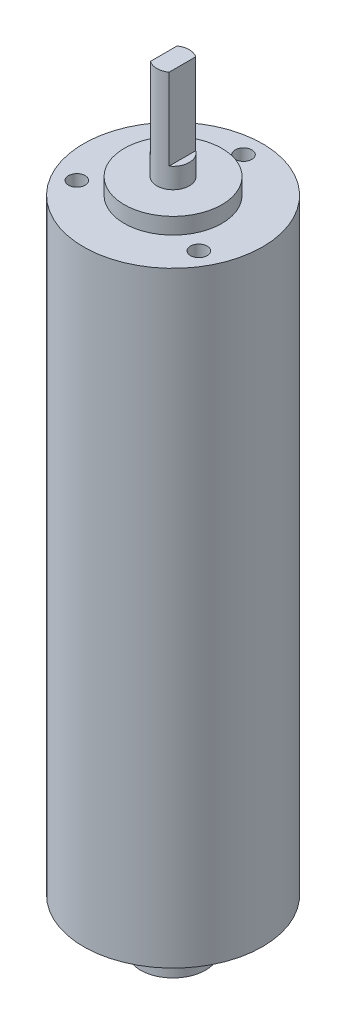
ISO-10303-21;
HEADER;
FILE_DESCRIPTION(('STEP AP214'),'2;1');
FILE_NAME('part.step','',(''),(''),'','','');
FILE_SCHEMA(('AUTOMOTIVE_DESIGN { 1 0 10303 214 1 1 1 1 }'));
ENDSEC;
DATA;
#1=APPLICATION_CONTEXT('core data for automotive mechanical design processes');
#2=APPLICATION_PROTOCOL_DEFINITION('international standard','automotive_design',2000,#1);
#3=PRODUCT_CONTEXT('',#1,'mechanical');
#4=PRODUCT('Part','Part','',(#3));
#5=PRODUCT_RELATED_PRODUCT_CATEGORY('part','',(#4));
#6=PRODUCT_DEFINITION_FORMATION('','',#4);
#7=PRODUCT_DEFINITION_CONTEXT('part definition',#1,'design');
#8=PRODUCT_DEFINITION('design','',#6,#7);
#9=PRODUCT_DEFINITION_SHAPE('','',#8);
#10=(LENGTH_UNIT() NAMED_UNIT(*) SI_UNIT(.MILLI.,.METRE.));
#11=(NAMED_UNIT(*) PLANE_ANGLE_UNIT() SI_UNIT($,.RADIAN.));
#12=(NAMED_UNIT(*) SI_UNIT($,.STERADIAN.) SOLID_ANGLE_UNIT());
#13=UNCERTAINTY_MEASURE_WITH_UNIT(LENGTH_MEASURE(1.E-05),#10,'distance_accuracy_value','');
#14=(GEOMETRIC_REPRESENTATION_CONTEXT(3) GLOBAL_UNCERTAINTY_ASSIGNED_CONTEXT((#13)) GLOBAL_UNIT_ASSIGNED_CONTEXT((#10,
#11,#12)) REPRESENTATION_CONTEXT('',''));
#15=CARTESIAN_POINT('',(0.,0.,0.));
#16=DIRECTION('',(0.,0.,1.));
#17=DIRECTION('',(1.,0.,0.));
#18=AXIS2_PLACEMENT_3D('',#15,#16,#17);
#19=CARTESIAN_POINT('',(0.,0.,0.));
#20=DIRECTION('',(0.,-1.,0.));
#21=DIRECTION('',(1.,0.,0.));
#22=AXIS2_PLACEMENT_3D('',#19,#20,#21);
#23=CYLINDRICAL_SURFACE('',#22,2.);
#24=CARTESIAN_POINT('',(0.,82.5,0.));
#25=DIRECTION('',(0.,-1.,0.));
#26=DIRECTION('',(1.,0.,0.));
#27=AXIS2_PLACEMENT_3D('',#24,#25,#26);
#28=CIRCLE('',#27,2.);
#29=CARTESIAN_POINT('',(2.,82.5,0.));
#30=VERTEX_POINT('',#29);
#31=EDGE_CURVE('E193',#30,#30,#28,.T.);
#32=ORIENTED_EDGE('',*,*,#31,.F.);
#33=EDGE_LOOP('',(#32));
#34=FACE_BOUND('',#33,.T.);
#35=CARTESIAN_POINT('',(0.,85.,0.));
#36=DIRECTION('',(0.,1.,0.));
#37=DIRECTION('',(0.,0.,1.));
#38=AXIS2_PLACEMENT_3D('',#35,#36,#37);
#39=CIRCLE('',#38,2.);
#40=CARTESIAN_POINT('',(-1.15,85.,-1.63630681719536));
#41=VERTEX_POINT('',#40);
#42=CARTESIAN_POINT('',(-1.15,85.,1.63630681719536));
#43=VERTEX_POINT('',#42);
#44=EDGE_CURVE('E161',#41,#43,#39,.T.);
#45=ORIENTED_EDGE('',*,*,#44,.F.);
#46=DIRECTION('',(0.,1.,0.));
#47=VECTOR('',#46,1.);
#48=CARTESIAN_POINT('',(-1.15,85.,-1.63630681719536));
#49=LINE('',#48,#47);
#50=CARTESIAN_POINT('',(-1.15,95.,-1.63630681719536));
#51=VERTEX_POINT('',#50);
#52=EDGE_CURVE('E166',#41,#51,#49,.T.);
#53=ORIENTED_EDGE('',*,*,#52,.T.);
#54=CARTESIAN_POINT('',(0.,95.,0.));
#55=DIRECTION('',(0.,-1.,0.));
#56=DIRECTION('',(1.,0.,0.));
#57=AXIS2_PLACEMENT_3D('',#54,#55,#56);
#58=CIRCLE('',#57,2.);
#59=CARTESIAN_POINT('',(1.15,95.,-1.63630681719536));
#60=VERTEX_POINT('',#59);
#61=EDGE_CURVE('E171',#51,#60,#58,.T.);
#62=ORIENTED_EDGE('',*,*,#61,.T.);
#63=DIRECTION('',(0.,1.,0.));
#64=VECTOR('',#63,1.);
#65=CARTESIAN_POINT('',(1.15,85.,-1.63630681719536));
#66=LINE('',#65,#64);
#67=CARTESIAN_POINT('',(1.15,85.,-1.63630681719536));
#68=VERTEX_POINT('',#67);
#69=EDGE_CURVE('E67',#68,#60,#66,.T.);
#70=ORIENTED_EDGE('',*,*,#69,.F.);
#71=CARTESIAN_POINT('',(0.,85.,0.));
#72=DIRECTION('',(0.,1.,0.));
#73=DIRECTION('',(0.,0.,1.));
#74=AXIS2_PLACEMENT_3D('',#71,#72,#73);
#75=CIRCLE('',#74,2.);
#76=CARTESIAN_POINT('',(1.15,85.,1.63630681719536));
#77=VERTEX_POINT('',#76);
#78=EDGE_CURVE('E175',#77,#68,#75,.T.);
#79=ORIENTED_EDGE('',*,*,#78,.F.);
#80=DIRECTION('',(0.,1.,0.));
#81=VECTOR('',#80,1.);
#82=CARTESIAN_POINT('',(1.15,85.,1.63630681719536));
#83=LINE('',#82,#81);
#84=CARTESIAN_POINT('',(1.15,95.,1.63630681719536));
#85=VERTEX_POINT('',#84);
#86=EDGE_CURVE('E168',#77,#85,#83,.T.);
#87=ORIENTED_EDGE('',*,*,#86,.T.);
#88=CARTESIAN_POINT('',(-1.15,95.,1.63630681719536));
#89=VERTEX_POINT('',#88);
#90=EDGE_CURVE('E189',#85,#89,#58,.T.);
#91=ORIENTED_EDGE('',*,*,#90,.T.);
#92=DIRECTION('',(0.,1.,0.));
#93=VECTOR('',#92,1.);
#94=CARTESIAN_POINT('',(-1.15,85.,1.63630681719536));
#95=LINE('',#94,#93);
#96=EDGE_CURVE('E75',#43,#89,#95,.T.);
#97=ORIENTED_EDGE('',*,*,#96,.F.);
#98=EDGE_LOOP('',(#45,#53,#62,#70,#79,#87,#91,#97));
#99=FACE_BOUND('',#98,.T.);
#100=ADVANCED_FACE('F51',(#34,#99),#23,.T.);
#101=CARTESIAN_POINT('',(2.,95.,0.));
#102=DIRECTION('',(0.,1.,0.));
#103=DIRECTION('',(-1.,0.,0.));
#104=AXIS2_PLACEMENT_3D('',#101,#102,#103);
#105=PLANE('',#104);
#106=ORIENTED_EDGE('',*,*,#61,.F.);
#107=DIRECTION('',(0.,0.,1.));
#108=VECTOR('',#107,1.);
#109=CARTESIAN_POINT('',(-1.15,95.,0.));
#110=LINE('',#109,#108);
#111=EDGE_CURVE('E162',#51,#89,#110,.T.);
#112=ORIENTED_EDGE('',*,*,#111,.T.);
#113=ORIENTED_EDGE('',*,*,#90,.F.);
#114=DIRECTION('',(0.,0.,1.));
#115=VECTOR('',#114,1.);
#116=CARTESIAN_POINT('',(1.15,95.,0.));
#117=LINE('',#116,#115);
#118=EDGE_CURVE('E157',#60,#85,#117,.T.);
#119=ORIENTED_EDGE('',*,*,#118,.F.);
#120=EDGE_LOOP('',(#106,#112,#113,#119));
#121=FACE_BOUND('',#120,.T.);
#122=ADVANCED_FACE('F240',(#121),#105,.T.);
#123=CARTESIAN_POINT('',(0.,0.,0.));
#124=DIRECTION('',(0.,-1.,0.));
#125=DIRECTION('',(1.,0.,0.));
#126=AXIS2_PLACEMENT_3D('',#123,#124,#125);
#127=PLANE('',#126);
#128=CARTESIAN_POINT('',(0.,0.,0.));
#129=DIRECTION('',(0.,-1.,0.));
#130=DIRECTION('',(1.,0.,0.));
#131=AXIS2_PLACEMENT_3D('',#128,#129,#130);
#132=CIRCLE('',#131,4.);
#133=CARTESIAN_POINT('',(4.,0.,0.));
#134=VERTEX_POINT('',#133);
#135=EDGE_CURVE('E11',#134,#134,#132,.T.);
#136=ORIENTED_EDGE('',*,*,#135,.T.);
#137=EDGE_LOOP('',(#136));
#138=FACE_BOUND('',#137,.T.);
#139=ADVANCED_FACE('F53',(#138),#127,.T.);
#140=CARTESIAN_POINT('',(0.,0.,0.));
#141=DIRECTION('',(0.,-1.,0.));
#142=DIRECTION('',(1.,0.,0.));
#143=AXIS2_PLACEMENT_3D('',#140,#141,#142);
#144=CYLINDRICAL_SURFACE('',#143,4.);
#145=CARTESIAN_POINT('',(0.,3.,0.));
#146=DIRECTION('',(0.,-1.,0.));
#147=DIRECTION('',(1.,0.,0.));
#148=AXIS2_PLACEMENT_3D('',#145,#146,#147);
#149=CIRCLE('',#148,4.);
#150=CARTESIAN_POINT('',(4.,3.,0.));
#151=VERTEX_POINT('',#150);
#152=EDGE_CURVE('E60',#151,#151,#149,.T.);
#153=ORIENTED_EDGE('',*,*,#152,.T.);
#154=EDGE_LOOP('',(#153));
#155=FACE_BOUND('',#154,.T.);
#156=ORIENTED_EDGE('',*,*,#135,.F.);
#157=EDGE_LOOP('',(#156));
#158=FACE_BOUND('',#157,.T.);
#159=ADVANCED_FACE('F224',(#155,#158),#144,.T.);
#160=CARTESIAN_POINT('',(4.,3.,0.));
#161=DIRECTION('',(0.,1.,0.));
#162=DIRECTION('',(-1.,0.,0.));
#163=AXIS2_PLACEMENT_3D('',#160,#161,#162);
#164=PLANE('',#163);
#165=CARTESIAN_POINT('',(0.,3.,0.));
#166=DIRECTION('',(0.,-1.,0.));
#167=DIRECTION('',(1.,0.,0.));
#168=AXIS2_PLACEMENT_3D('',#165,#166,#167);
#169=CIRCLE('',#168,1.5);
#170=CARTESIAN_POINT('',(1.5,3.,0.));
#171=VERTEX_POINT('',#170);
#172=EDGE_CURVE('E217',#171,#171,#169,.T.);
#173=ORIENTED_EDGE('',*,*,#172,.T.);
#174=EDGE_LOOP('',(#173));
#175=FACE_BOUND('',#174,.T.);
#176=ORIENTED_EDGE('',*,*,#152,.F.);
#177=EDGE_LOOP('',(#176));
#178=FACE_BOUND('',#177,.T.);
#179=ADVANCED_FACE('F227',(#175,#178),#164,.T.);
#180=CARTESIAN_POINT('',(0.,0.,0.));
#181=DIRECTION('',(0.,-1.,0.));
#182=DIRECTION('',(1.,0.,0.));
#183=AXIS2_PLACEMENT_3D('',#180,#181,#182);
#184=CYLINDRICAL_SURFACE('',#183,1.5);
#185=CARTESIAN_POINT('',(0.,6.,0.));
#186=DIRECTION('',(0.,-1.,0.));
#187=DIRECTION('',(1.,0.,0.));
#188=AXIS2_PLACEMENT_3D('',#185,#186,#187);
#189=CIRCLE('',#188,1.5);
#190=CARTESIAN_POINT('',(1.5,6.,0.));
#191=VERTEX_POINT('',#190);
#192=EDGE_CURVE('E213',#191,#191,#189,.T.);
#193=ORIENTED_EDGE('',*,*,#192,.T.);
#194=EDGE_LOOP('',(#193));
#195=FACE_BOUND('',#194,.T.);
#196=ORIENTED_EDGE('',*,*,#172,.F.);
#197=EDGE_LOOP('',(#196));
#198=FACE_BOUND('',#197,.T.);
#199=ADVANCED_FACE('F229',(#195,#198),#184,.T.);
#200=CARTESIAN_POINT('',(1.5,6.,0.));
#201=DIRECTION('',(0.,-1.,0.));
#202=DIRECTION('',(1.,0.,0.));
#203=AXIS2_PLACEMENT_3D('',#200,#201,#202);
#204=PLANE('',#203);
#205=CARTESIAN_POINT('',(6.5,6.,0.));
#206=DIRECTION('',(0.,-1.,0.));
#207=DIRECTION('',(0.,0.,-1.));
#208=AXIS2_PLACEMENT_3D('',#205,#206,#207);
#209=CIRCLE('',#208,0.799999999999999);
#210=CARTESIAN_POINT('',(6.5,6.,-0.799999999999999));
#211=VERTEX_POINT('',#210);
#212=EDGE_CURVE('E119',#211,#211,#209,.T.);
#213=ORIENTED_EDGE('',*,*,#212,.F.);
#214=EDGE_LOOP('',(#213));
#215=FACE_BOUND('',#214,.T.);
#216=CARTESIAN_POINT('',(-6.5,6.,0.));
#217=DIRECTION('',(0.,-1.,0.));
#218=DIRECTION('',(0.,0.,-1.));
#219=AXIS2_PLACEMENT_3D('',#216,#217,#218);
#220=CIRCLE('',#219,0.799999999999999);
#221=CARTESIAN_POINT('',(-6.5,6.,-0.799999999999999));
#222=VERTEX_POINT('',#221);
#223=EDGE_CURVE('E118',#222,#222,#220,.T.);
#224=ORIENTED_EDGE('',*,*,#223,.F.);
#225=EDGE_LOOP('',(#224));
#226=FACE_BOUND('',#225,.T.);
#227=CARTESIAN_POINT('',(0.,6.,0.));
#228=DIRECTION('',(0.,-1.,0.));
#229=DIRECTION('',(1.,0.,0.));
#230=AXIS2_PLACEMENT_3D('',#227,#228,#229);
#231=CIRCLE('',#230,11.);
#232=CARTESIAN_POINT('',(11.,6.,0.));
#233=VERTEX_POINT('',#232);
#234=EDGE_CURVE('E209',#233,#233,#231,.T.);
#235=ORIENTED_EDGE('',*,*,#234,.T.);
#236=EDGE_LOOP('',(#235));
#237=FACE_BOUND('',#236,.T.);
#238=ORIENTED_EDGE('',*,*,#192,.F.);
#239=EDGE_LOOP('',(#238));
#240=FACE_BOUND('',#239,.T.);
#241=ADVANCED_FACE('F236',(#215,#226,#237,#240),#204,.T.);
#242=CARTESIAN_POINT('',(0.,0.,0.));
#243=DIRECTION('',(0.,-1.,0.));
#244=DIRECTION('',(1.,0.,0.));
#245=AXIS2_PLACEMENT_3D('',#242,#243,#244);
#246=CYLINDRICAL_SURFACE('',#245,11.);
#247=CARTESIAN_POINT('',(0.,80.5,0.));
#248=DIRECTION('',(0.,-1.,0.));
#249=DIRECTION('',(1.,0.,0.));
#250=AXIS2_PLACEMENT_3D('',#247,#248,#249);
#251=CIRCLE('',#250,11.);
#252=CARTESIAN_POINT('',(11.,80.5,0.));
#253=VERTEX_POINT('',#252);
#254=EDGE_CURVE('E205',#253,#253,#251,.T.);
#255=ORIENTED_EDGE('',*,*,#254,.T.);
#256=EDGE_LOOP('',(#255));
#257=FACE_BOUND('',#256,.T.);
#258=ORIENTED_EDGE('',*,*,#234,.F.);
#259=EDGE_LOOP('',(#258));
#260=FACE_BOUND('',#259,.T.);
#261=ADVANCED_FACE('F264',(#257,#260),#246,.T.);
#262=CARTESIAN_POINT('',(11.,80.5,0.));
#263=DIRECTION('',(0.,1.,0.));
#264=DIRECTION('',(-1.,0.,0.));
#265=AXIS2_PLACEMENT_3D('',#262,#263,#264);
#266=PLANE('',#265);
#267=CARTESIAN_POINT('',(0.,80.5,-8.66025403784439));
#268=DIRECTION('',(0.,1.,0.));
#269=DIRECTION('',(0.,0.,1.));
#270=AXIS2_PLACEMENT_3D('',#267,#268,#269);
#271=CIRCLE('',#270,1.025);
#272=CARTESIAN_POINT('',(0.,80.5,-7.63525403784439));
#273=VERTEX_POINT('',#272);
#274=EDGE_CURVE('E133',#273,#273,#271,.T.);
#275=ORIENTED_EDGE('',*,*,#274,.F.);
#276=EDGE_LOOP('',(#275));
#277=FACE_BOUND('',#276,.T.);
#278=CARTESIAN_POINT('',(-7.5,80.5,4.3301270189222));
#279=DIRECTION('',(0.,1.,0.));
#280=DIRECTION('',(0.,0.,1.));
#281=AXIS2_PLACEMENT_3D('',#278,#279,#280);
#282=CIRCLE('',#281,1.025);
#283=CARTESIAN_POINT('',(-7.5,80.5,5.3551270189222));
#284=VERTEX_POINT('',#283);
#285=EDGE_CURVE('E141',#284,#284,#282,.T.);
#286=ORIENTED_EDGE('',*,*,#285,.F.);
#287=EDGE_LOOP('',(#286));
#288=FACE_BOUND('',#287,.T.);
#289=CARTESIAN_POINT('',(7.5,80.5,4.3301270189222));
#290=DIRECTION('',(0.,1.,0.));
#291=DIRECTION('',(0.,0.,1.));
#292=AXIS2_PLACEMENT_3D('',#289,#290,#291);
#293=CIRCLE('',#292,1.025);
#294=CARTESIAN_POINT('',(7.5,80.5,5.3551270189222));
#295=VERTEX_POINT('',#294);
#296=EDGE_CURVE('E149',#295,#295,#293,.T.);
#297=ORIENTED_EDGE('',*,*,#296,.F.);
#298=EDGE_LOOP('',(#297));
#299=FACE_BOUND('',#298,.T.);
#300=CARTESIAN_POINT('',(0.,80.5,0.));
#301=DIRECTION('',(0.,-1.,0.));
#302=DIRECTION('',(1.,0.,0.));
#303=AXIS2_PLACEMENT_3D('',#300,#301,#302);
#304=CIRCLE('',#303,6.);
#305=CARTESIAN_POINT('',(6.,80.5,0.));
#306=VERTEX_POINT('',#305);
#307=EDGE_CURVE('E201',#306,#306,#304,.T.);
#308=ORIENTED_EDGE('',*,*,#307,.T.);
#309=EDGE_LOOP('',(#308));
#310=FACE_BOUND('',#309,.T.);
#311=ORIENTED_EDGE('',*,*,#254,.F.);
#312=EDGE_LOOP('',(#311));
#313=FACE_BOUND('',#312,.T.);
#314=ADVANCED_FACE('F260',(#277,#288,#299,#310,#313),#266,.T.);
#315=CARTESIAN_POINT('',(0.,0.,0.));
#316=DIRECTION('',(0.,-1.,0.));
#317=DIRECTION('',(1.,0.,0.));
#318=AXIS2_PLACEMENT_3D('',#315,#316,#317);
#319=CYLINDRICAL_SURFACE('',#318,6.);
#320=CARTESIAN_POINT('',(0.,82.5,0.));
#321=DIRECTION('',(0.,-1.,0.));
#322=DIRECTION('',(1.,0.,0.));
#323=AXIS2_PLACEMENT_3D('',#320,#321,#322);
#324=CIRCLE('',#323,6.);
#325=CARTESIAN_POINT('',(6.,82.5,0.));
#326=VERTEX_POINT('',#325);
#327=EDGE_CURVE('E197',#326,#326,#324,.T.);
#328=ORIENTED_EDGE('',*,*,#327,.T.);
#329=EDGE_LOOP('',(#328));
#330=FACE_BOUND('',#329,.T.);
#331=ORIENTED_EDGE('',*,*,#307,.F.);
#332=EDGE_LOOP('',(#331));
#333=FACE_BOUND('',#332,.T.);
#334=ADVANCED_FACE('F256',(#330,#333),#319,.T.);
#335=CARTESIAN_POINT('',(6.,82.5,0.));
#336=DIRECTION('',(0.,1.,0.));
#337=DIRECTION('',(-1.,0.,0.));
#338=AXIS2_PLACEMENT_3D('',#335,#336,#337);
#339=PLANE('',#338);
#340=ORIENTED_EDGE('',*,*,#31,.T.);
#341=EDGE_LOOP('',(#340));
#342=FACE_BOUND('',#341,.T.);
#343=ORIENTED_EDGE('',*,*,#327,.F.);
#344=EDGE_LOOP('',(#343));
#345=FACE_BOUND('',#344,.T.);
#346=ADVANCED_FACE('F252',(#342,#345),#339,.T.);
#347=CARTESIAN_POINT('',(1.15,85.,0.));
#348=DIRECTION('',(-1.,0.,0.));
#349=DIRECTION('',(0.,0.,1.));
#350=AXIS2_PLACEMENT_3D('',#347,#348,#349);
#351=PLANE('',#350);
#352=ORIENTED_EDGE('',*,*,#118,.T.);
#353=ORIENTED_EDGE('',*,*,#86,.F.);
#354=DIRECTION('',(0.,0.,1.));
#355=VECTOR('',#354,1.);
#356=CARTESIAN_POINT('',(1.15,85.,0.));
#357=LINE('',#356,#355);
#358=EDGE_CURVE('E178',#68,#77,#357,.T.);
#359=ORIENTED_EDGE('',*,*,#358,.F.);
#360=ORIENTED_EDGE('',*,*,#69,.T.);
#361=EDGE_LOOP('',(#352,#353,#359,#360));
#362=FACE_BOUND('',#361,.T.);
#363=ADVANCED_FACE('F255',(#362),#351,.F.);
#364=CARTESIAN_POINT('',(0.,85.,0.));
#365=DIRECTION('',(0.,1.,0.));
#366=DIRECTION('',(0.,0.,1.));
#367=AXIS2_PLACEMENT_3D('',#364,#365,#366);
#368=PLANE('',#367);
#369=ORIENTED_EDGE('',*,*,#78,.T.);
#370=ORIENTED_EDGE('',*,*,#358,.T.);
#371=EDGE_LOOP('',(#369,#370));
#372=FACE_BOUND('',#371,.T.);
#373=ADVANCED_FACE('F326',(#372),#368,.T.);
#374=CARTESIAN_POINT('',(-1.15,85.,0.));
#375=DIRECTION('',(-1.,0.,0.));
#376=DIRECTION('',(0.,0.,1.));
#377=AXIS2_PLACEMENT_3D('',#374,#375,#376);
#378=PLANE('',#377);
#379=ORIENTED_EDGE('',*,*,#111,.F.);
#380=ORIENTED_EDGE('',*,*,#52,.F.);
#381=DIRECTION('',(0.,0.,1.));
#382=VECTOR('',#381,1.);
#383=CARTESIAN_POINT('',(-1.15,85.,0.));
#384=LINE('',#383,#382);
#385=EDGE_CURVE('E158',#41,#43,#384,.T.);
#386=ORIENTED_EDGE('',*,*,#385,.T.);
#387=ORIENTED_EDGE('',*,*,#96,.T.);
#388=EDGE_LOOP('',(#379,#380,#386,#387));
#389=FACE_BOUND('',#388,.T.);
#390=ADVANCED_FACE('F322',(#389),#378,.T.);
#391=CARTESIAN_POINT('',(0.,85.,0.));
#392=DIRECTION('',(0.,1.,0.));
#393=DIRECTION('',(0.,0.,1.));
#394=AXIS2_PLACEMENT_3D('',#391,#392,#393);
#395=PLANE('',#394);
#396=ORIENTED_EDGE('',*,*,#385,.F.);
#397=ORIENTED_EDGE('',*,*,#44,.T.);
#398=EDGE_LOOP('',(#396,#397));
#399=FACE_BOUND('',#398,.T.);
#400=ADVANCED_FACE('F318',(#399),#395,.T.);
#401=CARTESIAN_POINT('',(7.5,74.15,4.3301270189222));
#402=DIRECTION('',(0.,1.,0.));
#403=DIRECTION('',(0.,0.,1.));
#404=AXIS2_PLACEMENT_3D('',#401,#402,#403);
#405=CONICAL_SURFACE('',#404,1.025,1.02974425867665);
#406=CARTESIAN_POINT('',(7.5,73.5341178654968,4.3301270189222));
#407=VERTEX_POINT('',#406);
#408=VERTEX_LOOP('',#407);
#409=FACE_BOUND('',#408,.T.);
#410=CARTESIAN_POINT('',(7.5,74.15,4.3301270189222));
#411=DIRECTION('',(0.,1.,0.));
#412=DIRECTION('',(0.,0.,1.));
#413=AXIS2_PLACEMENT_3D('',#410,#411,#412);
#414=CIRCLE('',#413,1.025);
#415=CARTESIAN_POINT('',(7.5,74.15,5.35512701892219));
#416=VERTEX_POINT('',#415);
#417=EDGE_CURVE('E153',#416,#416,#414,.T.);
#418=ORIENTED_EDGE('',*,*,#417,.T.);
#419=EDGE_LOOP('',(#418));
#420=FACE_BOUND('',#419,.T.);
#421=ADVANCED_FACE('F314',(#409,#420),#405,.F.);
#422=CARTESIAN_POINT('',(7.5,80.5,4.3301270189222));
#423=DIRECTION('',(0.,1.,0.));
#424=DIRECTION('',(0.,0.,1.));
#425=AXIS2_PLACEMENT_3D('',#422,#423,#424);
#426=CYLINDRICAL_SURFACE('',#425,1.025);
#427=ORIENTED_EDGE('',*,*,#417,.F.);
#428=EDGE_LOOP('',(#427));
#429=FACE_BOUND('',#428,.T.);
#430=ORIENTED_EDGE('',*,*,#296,.T.);
#431=EDGE_LOOP('',(#430));
#432=FACE_BOUND('',#431,.T.);
#433=ADVANCED_FACE('F310',(#429,#432),#426,.F.);
#434=CARTESIAN_POINT('',(-7.5,74.15,4.3301270189222));
#435=DIRECTION('',(0.,1.,0.));
#436=DIRECTION('',(0.,0.,1.));
#437=AXIS2_PLACEMENT_3D('',#434,#435,#436);
#438=CONICAL_SURFACE('',#437,1.025,1.02974425867665);
#439=CARTESIAN_POINT('',(-7.5,73.5341178654968,4.3301270189222));
#440=VERTEX_POINT('',#439);
#441=VERTEX_LOOP('',#440);
#442=FACE_BOUND('',#441,.T.);
#443=CARTESIAN_POINT('',(-7.5,74.15,4.3301270189222));
#444=DIRECTION('',(0.,1.,0.));
#445=DIRECTION('',(0.,0.,1.));
#446=AXIS2_PLACEMENT_3D('',#443,#444,#445);
#447=CIRCLE('',#446,1.025);
#448=CARTESIAN_POINT('',(-7.5,74.15,5.3551270189222));
#449=VERTEX_POINT('',#448);
#450=EDGE_CURVE('E145',#449,#449,#447,.T.);
#451=ORIENTED_EDGE('',*,*,#450,.T.);
#452=EDGE_LOOP('',(#451));
#453=FACE_BOUND('',#452,.T.);
#454=ADVANCED_FACE('F306',(#442,#453),#438,.F.);
#455=CARTESIAN_POINT('',(-7.5,80.5,4.3301270189222));
#456=DIRECTION('',(0.,1.,0.));
#457=DIRECTION('',(0.,0.,1.));
#458=AXIS2_PLACEMENT_3D('',#455,#456,#457);
#459=CYLINDRICAL_SURFACE('',#458,1.025);
#460=ORIENTED_EDGE('',*,*,#450,.F.);
#461=EDGE_LOOP('',(#460));
#462=FACE_BOUND('',#461,.T.);
#463=ORIENTED_EDGE('',*,*,#285,.T.);
#464=EDGE_LOOP('',(#463));
#465=FACE_BOUND('',#464,.T.);
#466=ADVANCED_FACE('F302',(#462,#465),#459,.F.);
#467=CARTESIAN_POINT('',(0.,74.15,-8.66025403784439));
#468=DIRECTION('',(0.,1.,0.));
#469=DIRECTION('',(0.,0.,1.));
#470=AXIS2_PLACEMENT_3D('',#467,#468,#469);
#471=CONICAL_SURFACE('',#470,1.025,1.02974425867665);
#472=CARTESIAN_POINT('',(0.,73.5341178654968,-8.66025403784439));
#473=VERTEX_POINT('',#472);
#474=VERTEX_LOOP('',#473);
#475=FACE_BOUND('',#474,.T.);
#476=CARTESIAN_POINT('',(0.,74.15,-8.66025403784439));
#477=DIRECTION('',(0.,1.,0.));
#478=DIRECTION('',(0.,0.,1.));
#479=AXIS2_PLACEMENT_3D('',#476,#477,#478);
#480=CIRCLE('',#479,1.025);
#481=CARTESIAN_POINT('',(0.,74.15,-7.63525403784439));
#482=VERTEX_POINT('',#481);
#483=EDGE_CURVE('E137',#482,#482,#480,.T.);
#484=ORIENTED_EDGE('',*,*,#483,.T.);
#485=EDGE_LOOP('',(#484));
#486=FACE_BOUND('',#485,.T.);
#487=ADVANCED_FACE('F298',(#475,#486),#471,.F.);
#488=CARTESIAN_POINT('',(0.,80.5,-8.66025403784439));
#489=DIRECTION('',(0.,1.,0.));
#490=DIRECTION('',(0.,0.,1.));
#491=AXIS2_PLACEMENT_3D('',#488,#489,#490);
#492=CYLINDRICAL_SURFACE('',#491,1.025);
#493=ORIENTED_EDGE('',*,*,#483,.F.);
#494=EDGE_LOOP('',(#493));
#495=FACE_BOUND('',#494,.T.);
#496=ORIENTED_EDGE('',*,*,#274,.T.);
#497=EDGE_LOOP('',(#496));
#498=FACE_BOUND('',#497,.T.);
#499=ADVANCED_FACE('F290',(#495,#498),#492,.F.);
#500=CARTESIAN_POINT('',(-6.5,11.2,0.));
#501=DIRECTION('',(0.,-1.,0.));
#502=DIRECTION('',(0.,0.,-1.));
#503=AXIS2_PLACEMENT_3D('',#500,#501,#502);
#504=CONICAL_SURFACE('',#503,0.799999999999999,1.02974425867665);
#505=CARTESIAN_POINT('',(-6.5,11.680688495222,0.));
#506=VERTEX_POINT('',#505);
#507=VERTEX_LOOP('',#506);
#508=FACE_BOUND('',#507,.T.);
#509=CARTESIAN_POINT('',(-6.5,11.2,0.));
#510=DIRECTION('',(0.,-1.,0.));
#511=DIRECTION('',(0.,0.,-1.));
#512=AXIS2_PLACEMENT_3D('',#509,#510,#511);
#513=CIRCLE('',#512,0.799999999999999);
#514=CARTESIAN_POINT('',(-6.5,11.2,-0.799999999999999));
#515=VERTEX_POINT('',#514);
#516=EDGE_CURVE('E124',#515,#515,#513,.T.);
#517=ORIENTED_EDGE('',*,*,#516,.T.);
#518=EDGE_LOOP('',(#517));
#519=FACE_BOUND('',#518,.T.);
#520=ADVANCED_FACE('F285',(#508,#519),#504,.F.);
#521=CARTESIAN_POINT('',(-6.5,6.,0.));
#522=DIRECTION('',(0.,-1.,0.));
#523=DIRECTION('',(0.,0.,-1.));
#524=AXIS2_PLACEMENT_3D('',#521,#522,#523);
#525=CYLINDRICAL_SURFACE('',#524,0.799999999999999);
#526=ORIENTED_EDGE('',*,*,#516,.F.);
#527=EDGE_LOOP('',(#526));
#528=FACE_BOUND('',#527,.T.);
#529=ORIENTED_EDGE('',*,*,#223,.T.);
#530=EDGE_LOOP('',(#529));
#531=FACE_BOUND('',#530,.T.);
#532=ADVANCED_FACE('F111',(#528,#531),#525,.F.);
#533=CARTESIAN_POINT('',(6.5,11.2,0.));
#534=DIRECTION('',(0.,-1.,0.));
#535=DIRECTION('',(0.,0.,-1.));
#536=AXIS2_PLACEMENT_3D('',#533,#534,#535);
#537=CONICAL_SURFACE('',#536,0.799999999999999,1.02974425867665);
#538=CARTESIAN_POINT('',(6.5,11.680688495222,0.));
#539=VERTEX_POINT('',#538);
#540=VERTEX_LOOP('',#539);
#541=FACE_BOUND('',#540,.T.);
#542=CARTESIAN_POINT('',(6.5,11.2,0.));
#543=DIRECTION('',(0.,-1.,0.));
#544=DIRECTION('',(0.,0.,-1.));
#545=AXIS2_PLACEMENT_3D('',#542,#543,#544);
#546=CIRCLE('',#545,0.799999999999999);
#547=CARTESIAN_POINT('',(6.5,11.2,-0.799999999999999));
#548=VERTEX_POINT('',#547);
#549=EDGE_CURVE('E115',#548,#548,#546,.T.);
#550=ORIENTED_EDGE('',*,*,#549,.T.);
#551=EDGE_LOOP('',(#550));
#552=FACE_BOUND('',#551,.T.);
#553=ADVANCED_FACE('F107',(#541,#552),#537,.F.);
#554=CARTESIAN_POINT('',(6.5,6.,0.));
#555=DIRECTION('',(0.,-1.,0.));
#556=DIRECTION('',(0.,0.,-1.));
#557=AXIS2_PLACEMENT_3D('',#554,#555,#556);
#558=CYLINDRICAL_SURFACE('',#557,0.799999999999999);
#559=ORIENTED_EDGE('',*,*,#549,.F.);
#560=EDGE_LOOP('',(#559));
#561=FACE_BOUND('',#560,.T.);
#562=ORIENTED_EDGE('',*,*,#212,.T.);
#563=EDGE_LOOP('',(#562));
#564=FACE_BOUND('',#563,.T.);
#565=ADVANCED_FACE('F110',(#561,#564),#558,.F.);
#566=CLOSED_SHELL('',(#100,#122,#139,#159,#179,#199,#241,#261,#314,#334,#346,#363,#373,#390,
#400,#421,#433,#454,#466,#487,#499,#520,#532,#553,#565));
#567=MANIFOLD_SOLID_BREP('B2',#566);
#568=ADVANCED_BREP_SHAPE_REPRESENTATION('',(#18,#567),#14);
#569=SHAPE_DEFINITION_REPRESENTATION(#9,#568);
ENDSEC;
END-ISO-10303-21;
